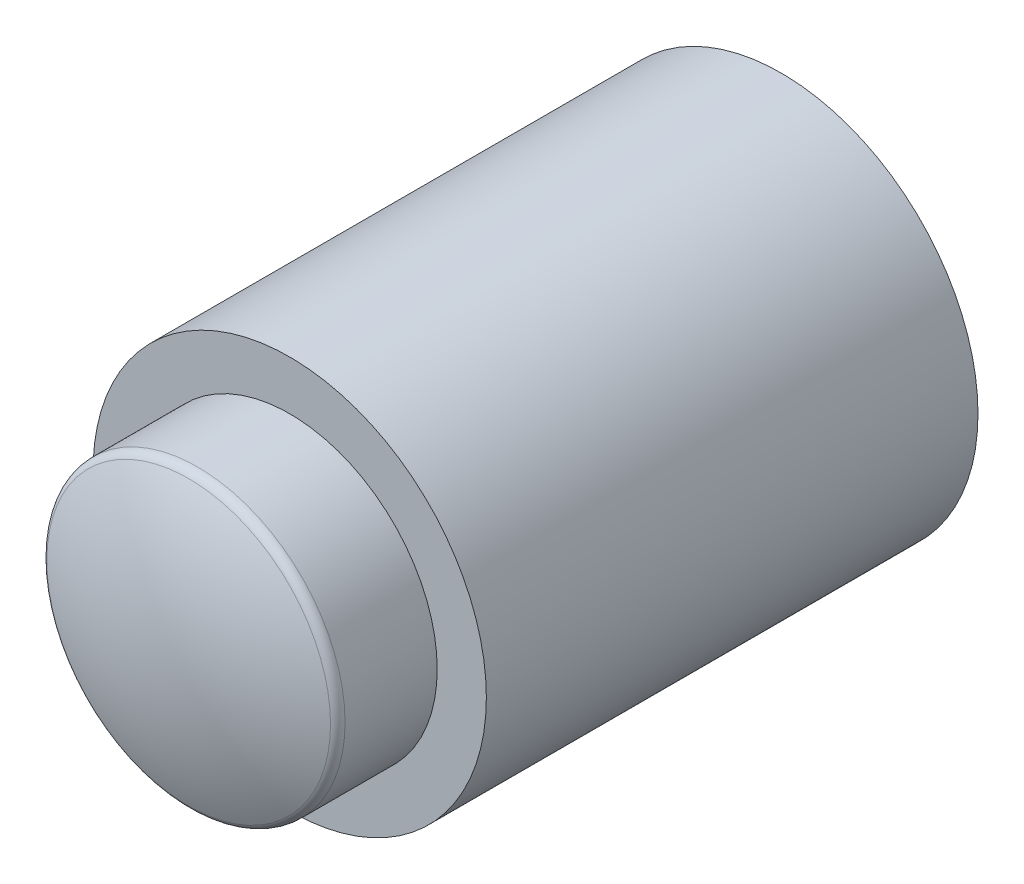
ISO-10303-21;
HEADER;
FILE_DESCRIPTION(('STEP AP214'),'2;1');
FILE_NAME('part.step','',(''),(''),'','','');
FILE_SCHEMA(('AUTOMOTIVE_DESIGN { 1 0 10303 214 1 1 1 1 }'));
ENDSEC;
DATA;
#1=APPLICATION_CONTEXT('core data for automotive mechanical design processes');
#2=APPLICATION_PROTOCOL_DEFINITION('international standard','automotive_design',2000,#1);
#3=PRODUCT_CONTEXT('',#1,'mechanical');
#4=PRODUCT('Part','Part','',(#3));
#5=PRODUCT_RELATED_PRODUCT_CATEGORY('part','',(#4));
#6=PRODUCT_DEFINITION_FORMATION('','',#4);
#7=PRODUCT_DEFINITION_CONTEXT('part definition',#1,'design');
#8=PRODUCT_DEFINITION('design','',#6,#7);
#9=PRODUCT_DEFINITION_SHAPE('','',#8);
#10=(LENGTH_UNIT() NAMED_UNIT(*) SI_UNIT(.MILLI.,.METRE.));
#11=(NAMED_UNIT(*) PLANE_ANGLE_UNIT() SI_UNIT($,.RADIAN.));
#12=(NAMED_UNIT(*) SI_UNIT($,.STERADIAN.) SOLID_ANGLE_UNIT());
#13=UNCERTAINTY_MEASURE_WITH_UNIT(LENGTH_MEASURE(1.E-05),#10,'distance_accuracy_value','');
#14=(GEOMETRIC_REPRESENTATION_CONTEXT(3) GLOBAL_UNCERTAINTY_ASSIGNED_CONTEXT((#13)) GLOBAL_UNIT_ASSIGNED_CONTEXT((#10,
#11,#12)) REPRESENTATION_CONTEXT('',''));
#15=CARTESIAN_POINT('',(0.,0.,0.));
#16=DIRECTION('',(0.,0.,1.));
#17=DIRECTION('',(1.,0.,0.));
#18=AXIS2_PLACEMENT_3D('',#15,#16,#17);
#19=CARTESIAN_POINT('',(0.,0.,20.));
#20=DIRECTION('',(0.,0.,-1.));
#21=DIRECTION('',(-1.,0.,0.));
#22=AXIS2_PLACEMENT_3D('',#19,#20,#21);
#23=CYLINDRICAL_SURFACE('',#22,30.);
#24=CARTESIAN_POINT('',(0.,0.,18.743775919407));
#25=DIRECTION('',(0.,0.,-1.));
#26=DIRECTION('',(-1.,0.,0.));
#27=AXIS2_PLACEMENT_3D('',#24,#25,#26);
#28=CIRCLE('',#27,30.);
#29=CARTESIAN_POINT('',(-30.,0.,18.743775919407));
#30=VERTEX_POINT('',#29);
#31=EDGE_CURVE('E10',#30,#30,#28,.T.);
#32=ORIENTED_EDGE('',*,*,#31,.T.);
#33=EDGE_LOOP('',(#32));
#34=FACE_BOUND('',#33,.T.);
#35=CARTESIAN_POINT('',(0.,0.,0.));
#36=DIRECTION('',(0.,0.,1.));
#37=DIRECTION('',(1.,0.,0.));
#38=AXIS2_PLACEMENT_3D('',#35,#36,#37);
#39=CIRCLE('',#38,30.);
#40=CARTESIAN_POINT('',(30.,0.,0.));
#41=VERTEX_POINT('',#40);
#42=EDGE_CURVE('E42',#41,#41,#39,.T.);
#43=ORIENTED_EDGE('',*,*,#42,.T.);
#44=EDGE_LOOP('',(#43));
#45=FACE_BOUND('',#44,.T.);
#46=ADVANCED_FACE('F31',(#34,#45),#23,.T.);
#47=CARTESIAN_POINT('',(0.,0.,-40.7857142857143));
#48=DIRECTION('',(0.,0.,1.));
#49=DIRECTION('',(1.,0.,0.));
#50=AXIS2_PLACEMENT_3D('',#47,#48,#49);
#51=SPHERICAL_SURFACE('',#50,67.7857142857143);
#52=CARTESIAN_POINT('',(0.,0.,20.5535758387809));
#53=DIRECTION('',(0.,0.,-1.));
#54=DIRECTION('',(-1.,0.,0.));
#55=AXIS2_PLACEMENT_3D('',#52,#53,#54);
#56=CIRCLE('',#55,28.8512486427796);
#57=CARTESIAN_POINT('',(-28.8512486427796,0.,20.5535758387809));
#58=VERTEX_POINT('',#57);
#59=EDGE_CURVE('E38',#58,#58,#56,.F.);
#60=ORIENTED_EDGE('',*,*,#59,.T.);
#61=EDGE_LOOP('',(#60));
#62=FACE_BOUND('',#61,.T.);
#63=ADVANCED_FACE('F60',(#62),#51,.T.);
#64=CARTESIAN_POINT('',(0.,0.,-100.));
#65=DIRECTION('',(0.,0.,1.));
#66=DIRECTION('',(1.,0.,0.));
#67=AXIS2_PLACEMENT_3D('',#64,#65,#66);
#68=CYLINDRICAL_SURFACE('',#67,40.);
#69=CARTESIAN_POINT('',(0.,0.,-100.));
#70=DIRECTION('',(0.,0.,-1.));
#71=DIRECTION('',(-1.,0.,0.));
#72=AXIS2_PLACEMENT_3D('',#69,#70,#71);
#73=CIRCLE('',#72,40.);
#74=CARTESIAN_POINT('',(40.,0.,-100.));
#75=VERTEX_POINT('',#74);
#76=EDGE_CURVE('E46',#75,#75,#73,.T.);
#77=CARTESIAN_POINT('',(0.,0.,0.));
#78=DIRECTION('',(0.,0.,-1.));
#79=DIRECTION('',(-1.,0.,0.));
#80=AXIS2_PLACEMENT_3D('',#77,#78,#79);
#81=CIRCLE('',#80,40.);
#82=CARTESIAN_POINT('',(40.,0.,0.));
#83=VERTEX_POINT('',#82);
#84=EDGE_CURVE('E49',#83,#83,#81,.T.);
#85=CARTESIAN_POINT('',(40.,0.,-100.));
#86=CARTESIAN_POINT('',(40.,0.,-98.9583333333333));
#87=CARTESIAN_POINT('',(40.,0.,-97.9166666666667));
#88=CARTESIAN_POINT('',(40.,0.,-95.8333333333333));
#89=CARTESIAN_POINT('',(40.,0.,-94.7916666666666));
#90=CARTESIAN_POINT('',(40.,0.,-92.7083333333333));
#91=CARTESIAN_POINT('',(40.,0.,-91.6666666666666));
#92=CARTESIAN_POINT('',(40.,0.,-89.5833333333333));
#93=CARTESIAN_POINT('',(40.,0.,-88.5416666666667));
#94=CARTESIAN_POINT('',(40.,0.,-86.4583333333333));
#95=CARTESIAN_POINT('',(40.,0.,-85.4166666666667));
#96=CARTESIAN_POINT('',(40.,0.,-83.3333333333333));
#97=CARTESIAN_POINT('',(40.,0.,-82.2916666666667));
#98=CARTESIAN_POINT('',(40.,0.,-80.2083333333333));
#99=CARTESIAN_POINT('',(40.,0.,-79.1666666666666));
#100=CARTESIAN_POINT('',(40.,0.,-77.0833333333333));
#101=CARTESIAN_POINT('',(40.,0.,-76.0416666666666));
#102=CARTESIAN_POINT('',(40.,0.,-73.9583333333333));
#103=CARTESIAN_POINT('',(40.,0.,-72.9166666666667));
#104=CARTESIAN_POINT('',(40.,0.,-70.8333333333333));
#105=CARTESIAN_POINT('',(40.,0.,-69.7916666666667));
#106=CARTESIAN_POINT('',(40.,0.,-67.7083333333333));
#107=CARTESIAN_POINT('',(40.,0.,-66.6666666666667));
#108=CARTESIAN_POINT('',(40.,0.,-64.5833333333333));
#109=CARTESIAN_POINT('',(40.,0.,-63.5416666666667));
#110=CARTESIAN_POINT('',(40.,0.,-61.4583333333333));
#111=CARTESIAN_POINT('',(40.,0.,-60.4166666666667));
#112=CARTESIAN_POINT('',(40.,0.,-58.3333333333333));
#113=CARTESIAN_POINT('',(40.,0.,-57.2916666666667));
#114=CARTESIAN_POINT('',(40.,0.,-55.2083333333333));
#115=CARTESIAN_POINT('',(40.,0.,-54.1666666666667));
#116=CARTESIAN_POINT('',(40.,0.,-52.0833333333333));
#117=CARTESIAN_POINT('',(40.,0.,-51.0416666666667));
#118=CARTESIAN_POINT('',(40.,0.,-48.9583333333333));
#119=CARTESIAN_POINT('',(40.,0.,-47.9166666666667));
#120=CARTESIAN_POINT('',(40.,0.,-45.8333333333333));
#121=CARTESIAN_POINT('',(40.,0.,-44.7916666666667));
#122=CARTESIAN_POINT('',(40.,0.,-42.7083333333333));
#123=CARTESIAN_POINT('',(40.,0.,-41.6666666666667));
#124=CARTESIAN_POINT('',(40.,0.,-39.5833333333333));
#125=CARTESIAN_POINT('',(40.,0.,-38.5416666666667));
#126=CARTESIAN_POINT('',(40.,0.,-36.4583333333333));
#127=CARTESIAN_POINT('',(40.,0.,-35.4166666666667));
#128=CARTESIAN_POINT('',(40.,0.,-33.3333333333333));
#129=CARTESIAN_POINT('',(40.,0.,-32.2916666666667));
#130=CARTESIAN_POINT('',(40.,0.,-30.2083333333333));
#131=CARTESIAN_POINT('',(40.,0.,-29.1666666666667));
#132=CARTESIAN_POINT('',(40.,0.,-27.0833333333333));
#133=CARTESIAN_POINT('',(40.,0.,-26.0416666666667));
#134=CARTESIAN_POINT('',(40.,0.,-23.9583333333333));
#135=CARTESIAN_POINT('',(40.,0.,-22.9166666666667));
#136=CARTESIAN_POINT('',(40.,0.,-20.8333333333333));
#137=CARTESIAN_POINT('',(40.,0.,-19.7916666666667));
#138=CARTESIAN_POINT('',(40.,0.,-17.7083333333333));
#139=CARTESIAN_POINT('',(40.,0.,-16.6666666666667));
#140=CARTESIAN_POINT('',(40.,0.,-14.5833333333333));
#141=CARTESIAN_POINT('',(40.,0.,-13.5416666666667));
#142=CARTESIAN_POINT('',(40.,0.,-11.4583333333333));
#143=CARTESIAN_POINT('',(40.,0.,-10.4166666666667));
#144=CARTESIAN_POINT('',(40.,0.,-8.33333333333333));
#145=CARTESIAN_POINT('',(40.,0.,-7.29166666666667));
#146=CARTESIAN_POINT('',(40.,0.,-5.20833333333334));
#147=CARTESIAN_POINT('',(40.,0.,-4.16666666666667));
#148=CARTESIAN_POINT('',(40.,0.,-2.08333333333334));
#149=CARTESIAN_POINT('',(40.,0.,-1.04166666666667));
#150=CARTESIAN_POINT('',(40.,0.,0.));
#151=B_SPLINE_CURVE_WITH_KNOTS('',3,(#85,#86,#87,#88,#89,#90,#91,#92,#93,#94,#95,#96,#97,#98,
#99,#100,#101,#102,#103,#104,#105,#106,#107,#108,#109,#110,#111,#112,#113,#114,#115,#116,#117,
#118,#119,#120,#121,#122,#123,#124,#125,#126,#127,#128,#129,#130,#131,#132,#133,#134,#135,#136,
#137,#138,#139,#140,#141,#142,#143,#144,#145,#146,#147,#148,#149,#150),.UNSPECIFIED.,.F.,.F.,(4,
2,2,2,2,2,2,2,2,2,2,2,2,2,2,2,2,2,2,2,2,2,2,2,2,2,2,2,2,2,2,2,4),(0.,3.12499999999999,
6.24999999999999,9.37499999999999,12.5,15.625,18.75,21.875,25.,28.125,31.25,34.375,37.5,40.625,
43.75,46.875,50.,53.125,56.25,59.375,62.5,65.625,68.75,71.875,75.,78.125,81.25,84.375,87.5,
90.625,93.75,96.875,100.),.UNSPECIFIED.);
#152=EDGE_CURVE('BSEAM57',#75,#83,#151,.T.);
#153=ORIENTED_EDGE('',*,*,#76,.F.);
#154=ORIENTED_EDGE('',*,*,#84,.T.);
#155=ORIENTED_EDGE('',*,*,#152,.T.);
#156=ORIENTED_EDGE('',*,*,#152,.F.);
#157=EDGE_LOOP('',(#153,#155,#154,#156));
#158=FACE_BOUND('',#157,.T.);
#159=ADVANCED_FACE('F57',(#158),#68,.T.);
#160=CARTESIAN_POINT('',(0.,0.,-100.));
#161=DIRECTION('',(0.,0.,-1.));
#162=DIRECTION('',(-1.,0.,0.));
#163=AXIS2_PLACEMENT_3D('',#160,#161,#162);
#164=PLANE('',#163);
#165=ORIENTED_EDGE('',*,*,#76,.T.);
#166=EDGE_LOOP('',(#165));
#167=FACE_BOUND('',#166,.T.);
#168=ADVANCED_FACE('F55',(#167),#164,.T.);
#169=CARTESIAN_POINT('',(0.,0.,0.));
#170=DIRECTION('',(0.,0.,-1.));
#171=DIRECTION('',(-1.,0.,0.));
#172=AXIS2_PLACEMENT_3D('',#169,#170,#171);
#173=PLANE('',#172);
#174=ORIENTED_EDGE('',*,*,#42,.F.);
#175=EDGE_LOOP('',(#174));
#176=FACE_BOUND('',#175,.T.);
#177=ORIENTED_EDGE('',*,*,#84,.F.);
#178=EDGE_LOOP('',(#177));
#179=FACE_BOUND('',#178,.T.);
#180=ADVANCED_FACE('F64',(#176,#179),#173,.F.);
#181=CARTESIAN_POINT('',(0.,0.,18.743775919407));
#182=DIRECTION('',(0.,0.,-1.));
#183=DIRECTION('',(-1.,0.,0.));
#184=AXIS2_PLACEMENT_3D('',#181,#182,#183);
#185=TOROIDAL_SURFACE('',#184,28.,2.);
#186=ORIENTED_EDGE('',*,*,#31,.F.);
#187=EDGE_LOOP('',(#186));
#188=FACE_BOUND('',#187,.T.);
#189=ORIENTED_EDGE('',*,*,#59,.F.);
#190=EDGE_LOOP('',(#189));
#191=FACE_BOUND('',#190,.T.);
#192=ADVANCED_FACE('F33',(#188,#191),#185,.T.);
#193=CLOSED_SHELL('',(#46,#63,#159,#168,#180,#192));
#194=MANIFOLD_SOLID_BREP('B2',#193);
#195=ADVANCED_BREP_SHAPE_REPRESENTATION('',(#18,#194),#14);
#196=SHAPE_DEFINITION_REPRESENTATION(#9,#195);
ENDSEC;
END-ISO-10303-21;
